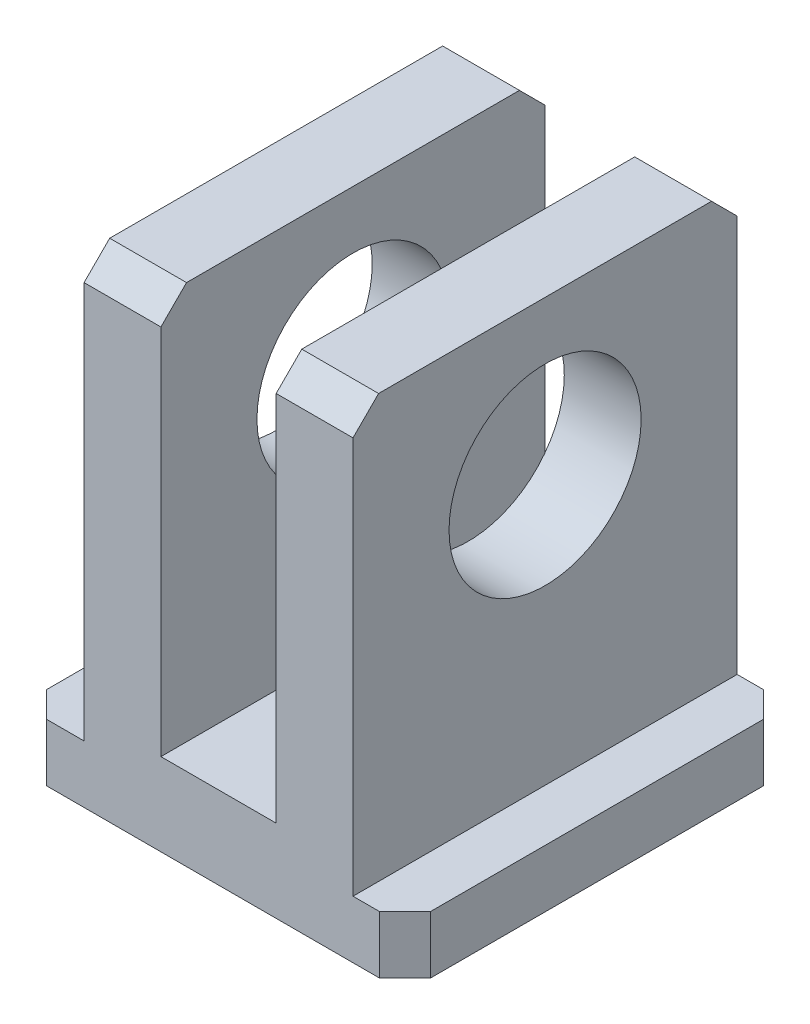
ISO-10303-21;
HEADER;
FILE_DESCRIPTION(('STEP AP214'),'2;1');
FILE_NAME('part.step','',(''),(''),'','','');
FILE_SCHEMA(('AUTOMOTIVE_DESIGN { 1 0 10303 214 1 1 1 1 }'));
ENDSEC;
DATA;
#1=APPLICATION_CONTEXT('core data for automotive mechanical design processes');
#2=APPLICATION_PROTOCOL_DEFINITION('international standard','automotive_design',2000,#1);
#3=PRODUCT_CONTEXT('',#1,'mechanical');
#4=PRODUCT('Part','Part','',(#3));
#5=PRODUCT_RELATED_PRODUCT_CATEGORY('part','',(#4));
#6=PRODUCT_DEFINITION_FORMATION('','',#4);
#7=PRODUCT_DEFINITION_CONTEXT('part definition',#1,'design');
#8=PRODUCT_DEFINITION('design','',#6,#7);
#9=PRODUCT_DEFINITION_SHAPE('','',#8);
#10=(LENGTH_UNIT() NAMED_UNIT(*) SI_UNIT(.MILLI.,.METRE.));
#11=(NAMED_UNIT(*) PLANE_ANGLE_UNIT() SI_UNIT($,.RADIAN.));
#12=(NAMED_UNIT(*) SI_UNIT($,.STERADIAN.) SOLID_ANGLE_UNIT());
#13=UNCERTAINTY_MEASURE_WITH_UNIT(LENGTH_MEASURE(1.E-05),#10,'distance_accuracy_value','');
#14=(GEOMETRIC_REPRESENTATION_CONTEXT(3) GLOBAL_UNCERTAINTY_ASSIGNED_CONTEXT((#13)) GLOBAL_UNIT_ASSIGNED_CONTEXT((#10,
#11,#12)) REPRESENTATION_CONTEXT('',''));
#15=CARTESIAN_POINT('',(0.,0.,0.));
#16=DIRECTION('',(0.,0.,1.));
#17=DIRECTION('',(1.,0.,0.));
#18=AXIS2_PLACEMENT_3D('',#15,#16,#17);
#19=CARTESIAN_POINT('',(15.,37.5,0.));
#20=DIRECTION('',(0.,0.,-1.));
#21=DIRECTION('',(-1.,0.,0.));
#22=AXIS2_PLACEMENT_3D('',#19,#20,#21);
#23=PLANE('',#22);
#24=DIRECTION('',(1.,0.,0.));
#25=VECTOR('',#24,1.);
#26=CARTESIAN_POINT('',(0.,4.50000000000001,0.));
#27=LINE('',#26,#25);
#28=CARTESIAN_POINT('',(-13.,4.49999999999999,0.));
#29=VERTEX_POINT('',#28);
#30=CARTESIAN_POINT('',(-10.0611181190047,4.5,0.));
#31=VERTEX_POINT('',#30);
#32=EDGE_CURVE('E200',#29,#31,#27,.T.);
#33=ORIENTED_EDGE('',*,*,#32,.F.);
#34=DIRECTION('',(0.,-1.,0.));
#35=VECTOR('',#34,1.);
#36=CARTESIAN_POINT('',(-13.,37.5,0.));
#37=LINE('',#36,#35);
#38=CARTESIAN_POINT('',(-13.,0.,0.));
#39=VERTEX_POINT('',#38);
#40=EDGE_CURVE('E286',#29,#39,#37,.T.);
#41=ORIENTED_EDGE('',*,*,#40,.T.);
#42=DIRECTION('',(-1.,0.,0.));
#43=VECTOR('',#42,1.);
#44=CARTESIAN_POINT('',(15.,0.,0.));
#45=LINE('',#44,#43);
#46=CARTESIAN_POINT('',(13.,0.,0.));
#47=VERTEX_POINT('',#46);
#48=EDGE_CURVE('E270',#47,#39,#45,.T.);
#49=ORIENTED_EDGE('',*,*,#48,.F.);
#50=DIRECTION('',(0.,1.,0.));
#51=VECTOR('',#50,1.);
#52=CARTESIAN_POINT('',(13.,4.49999999999999,0.));
#53=LINE('',#52,#51);
#54=CARTESIAN_POINT('',(13.,4.49999999999999,0.));
#55=VERTEX_POINT('',#54);
#56=EDGE_CURVE('E284',#47,#55,#53,.T.);
#57=ORIENTED_EDGE('',*,*,#56,.T.);
#58=DIRECTION('',(-1.,0.,0.));
#59=VECTOR('',#58,1.);
#60=CARTESIAN_POINT('',(0.,4.49999999999999,0.));
#61=LINE('',#60,#59);
#62=CARTESIAN_POINT('',(10.9388818809953,4.49999999999999,0.));
#63=VERTEX_POINT('',#62);
#64=EDGE_CURVE('E223',#55,#63,#61,.T.);
#65=ORIENTED_EDGE('',*,*,#64,.T.);
#66=DIRECTION('',(0.,1.,0.));
#67=VECTOR('',#66,1.);
#68=CARTESIAN_POINT('',(10.9388818809953,0.,0.));
#69=LINE('',#68,#67);
#70=CARTESIAN_POINT('',(10.9388818809953,35.5,0.));
#71=VERTEX_POINT('',#70);
#72=EDGE_CURVE('E226',#63,#71,#69,.T.);
#73=ORIENTED_EDGE('',*,*,#72,.T.);
#74=DIRECTION('',(-1.,0.,0.));
#75=VECTOR('',#74,1.);
#76=CARTESIAN_POINT('',(15.,35.5,0.));
#77=LINE('',#76,#75);
#78=CARTESIAN_POINT('',(4.93888188099532,35.5,0.));
#79=VERTEX_POINT('',#78);
#80=EDGE_CURVE('E281',#71,#79,#77,.T.);
#81=ORIENTED_EDGE('',*,*,#80,.T.);
#82=DIRECTION('',(0.,-1.,0.));
#83=VECTOR('',#82,1.);
#84=CARTESIAN_POINT('',(4.93888188099533,0.,0.));
#85=LINE('',#84,#83);
#86=CARTESIAN_POINT('',(4.93888188099533,6.44122754228266,0.));
#87=VERTEX_POINT('',#86);
#88=EDGE_CURVE('E249',#79,#87,#85,.T.);
#89=ORIENTED_EDGE('',*,*,#88,.T.);
#90=DIRECTION('',(1.,0.,0.));
#91=VECTOR('',#90,1.);
#92=CARTESIAN_POINT('',(0.,6.44122754228266,0.));
#93=LINE('',#92,#91);
#94=CARTESIAN_POINT('',(-4.06111811900468,6.44122754228266,0.));
#95=VERTEX_POINT('',#94);
#96=EDGE_CURVE('E217',#95,#87,#93,.T.);
#97=ORIENTED_EDGE('',*,*,#96,.F.);
#98=DIRECTION('',(0.,-1.,0.));
#99=VECTOR('',#98,1.);
#100=CARTESIAN_POINT('',(-4.06111811900468,0.,0.));
#101=LINE('',#100,#99);
#102=CARTESIAN_POINT('',(-4.06111811900467,35.5,0.));
#103=VERTEX_POINT('',#102);
#104=EDGE_CURVE('E242',#103,#95,#101,.T.);
#105=ORIENTED_EDGE('',*,*,#104,.F.);
#106=DIRECTION('',(-1.,0.,0.));
#107=VECTOR('',#106,1.);
#108=CARTESIAN_POINT('',(15.,35.5,0.));
#109=LINE('',#108,#107);
#110=CARTESIAN_POINT('',(-10.0611181190047,35.5,0.));
#111=VERTEX_POINT('',#110);
#112=EDGE_CURVE('E273',#103,#111,#109,.T.);
#113=ORIENTED_EDGE('',*,*,#112,.T.);
#114=DIRECTION('',(0.,1.,0.));
#115=VECTOR('',#114,1.);
#116=CARTESIAN_POINT('',(-10.0611181190047,0.,0.));
#117=LINE('',#116,#115);
#118=EDGE_CURVE('E193',#31,#111,#117,.T.);
#119=ORIENTED_EDGE('',*,*,#118,.F.);
#120=EDGE_LOOP('',(#33,#41,#49,#57,#65,#73,#81,#89,#97,#105,#113,#119));
#121=FACE_BOUND('',#120,.T.);
#122=ADVANCED_FACE('F43',(#121),#23,.F.);
#123=CARTESIAN_POINT('',(15.,0.,-30.));
#124=DIRECTION('',(0.,0.,1.));
#125=DIRECTION('',(1.,0.,0.));
#126=AXIS2_PLACEMENT_3D('',#123,#124,#125);
#127=PLANE('',#126);
#128=DIRECTION('',(-1.,0.,0.));
#129=VECTOR('',#128,1.);
#130=CARTESIAN_POINT('',(0.,4.49999999999999,-30.));
#131=LINE('',#130,#129);
#132=CARTESIAN_POINT('',(13.,4.49999999999999,-30.));
#133=VERTEX_POINT('',#132);
#134=CARTESIAN_POINT('',(10.9388818809953,4.49999999999999,-30.));
#135=VERTEX_POINT('',#134);
#136=EDGE_CURVE('E222',#133,#135,#131,.T.);
#137=ORIENTED_EDGE('',*,*,#136,.F.);
#138=DIRECTION('',(0.,-1.,0.));
#139=VECTOR('',#138,1.);
#140=CARTESIAN_POINT('',(13.,0.,-30.));
#141=LINE('',#140,#139);
#142=CARTESIAN_POINT('',(13.,0.,-30.));
#143=VERTEX_POINT('',#142);
#144=EDGE_CURVE('E320',#133,#143,#141,.T.);
#145=ORIENTED_EDGE('',*,*,#144,.T.);
#146=DIRECTION('',(-1.,0.,0.));
#147=VECTOR('',#146,1.);
#148=CARTESIAN_POINT('',(15.,0.,-30.));
#149=LINE('',#148,#147);
#150=CARTESIAN_POINT('',(-13.,0.,-30.));
#151=VERTEX_POINT('',#150);
#152=EDGE_CURVE('E266',#143,#151,#149,.T.);
#153=ORIENTED_EDGE('',*,*,#152,.T.);
#154=DIRECTION('',(0.,1.,0.));
#155=VECTOR('',#154,1.);
#156=CARTESIAN_POINT('',(-13.,0.,-30.));
#157=LINE('',#156,#155);
#158=CARTESIAN_POINT('',(-13.,4.49999999999999,-30.));
#159=VERTEX_POINT('',#158);
#160=EDGE_CURVE('E191',#151,#159,#157,.T.);
#161=ORIENTED_EDGE('',*,*,#160,.T.);
#162=DIRECTION('',(1.,0.,0.));
#163=VECTOR('',#162,1.);
#164=CARTESIAN_POINT('',(0.,4.50000000000001,-30.));
#165=LINE('',#164,#163);
#166=CARTESIAN_POINT('',(-10.0611181190047,4.5,-30.));
#167=VERTEX_POINT('',#166);
#168=EDGE_CURVE('E182',#159,#167,#165,.T.);
#169=ORIENTED_EDGE('',*,*,#168,.T.);
#170=DIRECTION('',(0.,1.,0.));
#171=VECTOR('',#170,1.);
#172=CARTESIAN_POINT('',(-10.0611181190047,0.,-30.));
#173=LINE('',#172,#171);
#174=CARTESIAN_POINT('',(-10.0611181190047,35.5,-30.));
#175=VERTEX_POINT('',#174);
#176=EDGE_CURVE('E187',#167,#175,#173,.T.);
#177=ORIENTED_EDGE('',*,*,#176,.T.);
#178=DIRECTION('',(1.,0.,0.));
#179=VECTOR('',#178,1.);
#180=CARTESIAN_POINT('',(15.,35.5,-30.));
#181=LINE('',#180,#179);
#182=CARTESIAN_POINT('',(-4.06111811900467,35.5,-30.));
#183=VERTEX_POINT('',#182);
#184=EDGE_CURVE('E317',#175,#183,#181,.T.);
#185=ORIENTED_EDGE('',*,*,#184,.T.);
#186=DIRECTION('',(0.,-1.,0.));
#187=VECTOR('',#186,1.);
#188=CARTESIAN_POINT('',(-4.06111811900468,0.,-30.));
#189=LINE('',#188,#187);
#190=CARTESIAN_POINT('',(-4.06111811900468,6.44122754228266,-30.));
#191=VERTEX_POINT('',#190);
#192=EDGE_CURVE('E244',#183,#191,#189,.T.);
#193=ORIENTED_EDGE('',*,*,#192,.T.);
#194=DIRECTION('',(1.,0.,0.));
#195=VECTOR('',#194,1.);
#196=CARTESIAN_POINT('',(0.,6.44122754228266,-30.));
#197=LINE('',#196,#195);
#198=CARTESIAN_POINT('',(4.93888188099533,6.44122754228266,-30.));
#199=VERTEX_POINT('',#198);
#200=EDGE_CURVE('E238',#191,#199,#197,.T.);
#201=ORIENTED_EDGE('',*,*,#200,.T.);
#202=DIRECTION('',(0.,-1.,0.));
#203=VECTOR('',#202,1.);
#204=CARTESIAN_POINT('',(4.93888188099533,0.,-30.));
#205=LINE('',#204,#203);
#206=CARTESIAN_POINT('',(4.93888188099532,35.5,-30.));
#207=VERTEX_POINT('',#206);
#208=EDGE_CURVE('E241',#207,#199,#205,.T.);
#209=ORIENTED_EDGE('',*,*,#208,.F.);
#210=DIRECTION('',(1.,0.,0.));
#211=VECTOR('',#210,1.);
#212=CARTESIAN_POINT('',(15.,35.5,-30.));
#213=LINE('',#212,#211);
#214=CARTESIAN_POINT('',(10.9388818809953,35.5,-30.));
#215=VERTEX_POINT('',#214);
#216=EDGE_CURVE('E315',#207,#215,#213,.T.);
#217=ORIENTED_EDGE('',*,*,#216,.T.);
#218=DIRECTION('',(0.,1.,0.));
#219=VECTOR('',#218,1.);
#220=CARTESIAN_POINT('',(10.9388818809953,0.,-30.));
#221=LINE('',#220,#219);
#222=EDGE_CURVE('E219',#135,#215,#221,.T.);
#223=ORIENTED_EDGE('',*,*,#222,.F.);
#224=EDGE_LOOP('',(#137,#145,#153,#161,#169,#177,#185,#193,#201,#209,#217,#223));
#225=FACE_BOUND('',#224,.T.);
#226=ADVANCED_FACE('F185',(#225),#127,.F.);
#227=CARTESIAN_POINT('',(15.,37.5,-30.));
#228=DIRECTION('',(0.,-1.,0.));
#229=DIRECTION('',(0.,0.,-1.));
#230=AXIS2_PLACEMENT_3D('',#227,#228,#229);
#231=PLANE('',#230);
#232=DIRECTION('',(0.,0.,1.));
#233=VECTOR('',#232,1.);
#234=CARTESIAN_POINT('',(4.93888188099533,37.5,-30.));
#235=LINE('',#234,#233);
#236=CARTESIAN_POINT('',(4.93888188099533,37.5,-28.));
#237=VERTEX_POINT('',#236);
#238=CARTESIAN_POINT('',(4.93888188099533,37.5,-2.00000000000002));
#239=VERTEX_POINT('',#238);
#240=EDGE_CURVE('E258',#237,#239,#235,.T.);
#241=ORIENTED_EDGE('',*,*,#240,.T.);
#242=DIRECTION('',(1.,0.,0.));
#243=VECTOR('',#242,1.);
#244=CARTESIAN_POINT('',(15.,37.5,-2.00000000000001));
#245=LINE('',#244,#243);
#246=CARTESIAN_POINT('',(10.9388818809953,37.5,-2.00000000000002));
#247=VERTEX_POINT('',#246);
#248=EDGE_CURVE('E329',#239,#247,#245,.T.);
#249=ORIENTED_EDGE('',*,*,#248,.T.);
#250=DIRECTION('',(0.,0.,1.));
#251=VECTOR('',#250,1.);
#252=CARTESIAN_POINT('',(10.9388818809953,37.5,-30.));
#253=LINE('',#252,#251);
#254=CARTESIAN_POINT('',(10.9388818809953,37.5,-28.));
#255=VERTEX_POINT('',#254);
#256=EDGE_CURVE('E213',#255,#247,#253,.T.);
#257=ORIENTED_EDGE('',*,*,#256,.F.);
#258=DIRECTION('',(-1.,0.,0.));
#259=VECTOR('',#258,1.);
#260=CARTESIAN_POINT('',(15.,37.5,-28.));
#261=LINE('',#260,#259);
#262=EDGE_CURVE('E326',#255,#237,#261,.T.);
#263=ORIENTED_EDGE('',*,*,#262,.T.);
#264=EDGE_LOOP('',(#241,#249,#257,#263));
#265=FACE_BOUND('',#264,.T.);
#266=ADVANCED_FACE('F375',(#265),#231,.F.);
#267=CARTESIAN_POINT('',(15.,0.,0.));
#268=DIRECTION('',(1.,0.,0.));
#269=DIRECTION('',(0.,0.,-1.));
#270=AXIS2_PLACEMENT_3D('',#267,#268,#269);
#271=PLANE('',#270);
#272=DIRECTION('',(0.,0.,1.));
#273=VECTOR('',#272,1.);
#274=CARTESIAN_POINT('',(15.,4.49999999999999,-30.));
#275=LINE('',#274,#273);
#276=CARTESIAN_POINT('',(15.,4.49999999999999,-28.));
#277=VERTEX_POINT('',#276);
#278=CARTESIAN_POINT('',(15.,4.49999999999999,-2.00000000000001));
#279=VERTEX_POINT('',#278);
#280=EDGE_CURVE('E233',#277,#279,#275,.T.);
#281=ORIENTED_EDGE('',*,*,#280,.T.);
#282=DIRECTION('',(0.,-1.,0.));
#283=VECTOR('',#282,1.);
#284=CARTESIAN_POINT('',(15.,0.,-2.));
#285=LINE('',#284,#283);
#286=CARTESIAN_POINT('',(15.,0.,-2.));
#287=VERTEX_POINT('',#286);
#288=EDGE_CURVE('E308',#279,#287,#285,.T.);
#289=ORIENTED_EDGE('',*,*,#288,.T.);
#290=DIRECTION('',(0.,0.,-1.));
#291=VECTOR('',#290,1.);
#292=CARTESIAN_POINT('',(15.,0.,0.));
#293=LINE('',#292,#291);
#294=CARTESIAN_POINT('',(15.,0.,-28.));
#295=VERTEX_POINT('',#294);
#296=EDGE_CURVE('E263',#287,#295,#293,.T.);
#297=ORIENTED_EDGE('',*,*,#296,.T.);
#298=DIRECTION('',(0.,1.,0.));
#299=VECTOR('',#298,1.);
#300=CARTESIAN_POINT('',(15.,4.49999999999999,-28.));
#301=LINE('',#300,#299);
#302=EDGE_CURVE('E305',#295,#277,#301,.T.);
#303=ORIENTED_EDGE('',*,*,#302,.T.);
#304=EDGE_LOOP('',(#281,#289,#297,#303));
#305=FACE_BOUND('',#304,.T.);
#306=ADVANCED_FACE('F463',(#305),#271,.T.);
#307=CARTESIAN_POINT('',(15.,0.,0.));
#308=DIRECTION('',(0.,1.,0.));
#309=DIRECTION('',(0.,0.,1.));
#310=AXIS2_PLACEMENT_3D('',#307,#308,#309);
#311=PLANE('',#310);
#312=ORIENTED_EDGE('',*,*,#48,.T.);
#313=DIRECTION('',(0.707106781186546,0.,0.707106781186549));
#314=VECTOR('',#313,1.);
#315=CARTESIAN_POINT('',(-13.,0.,0.));
#316=LINE('',#315,#314);
#317=CARTESIAN_POINT('',(-15.,0.,-2.00000000000001));
#318=VERTEX_POINT('',#317);
#319=EDGE_CURVE('E295',#39,#318,#316,.F.);
#320=ORIENTED_EDGE('',*,*,#319,.T.);
#321=DIRECTION('',(0.,0.,-1.));
#322=VECTOR('',#321,1.);
#323=CARTESIAN_POINT('',(-15.,0.,0.));
#324=LINE('',#323,#322);
#325=CARTESIAN_POINT('',(-15.,0.,-28.));
#326=VERTEX_POINT('',#325);
#327=EDGE_CURVE('E255',#318,#326,#324,.T.);
#328=ORIENTED_EDGE('',*,*,#327,.T.);
#329=DIRECTION('',(-0.707106781186546,0.,0.707106781186549));
#330=VECTOR('',#329,1.);
#331=CARTESIAN_POINT('',(-13.,0.,-30.));
#332=LINE('',#331,#330);
#333=EDGE_CURVE('E289',#326,#151,#332,.F.);
#334=ORIENTED_EDGE('',*,*,#333,.T.);
#335=ORIENTED_EDGE('',*,*,#152,.F.);
#336=DIRECTION('',(0.707106781186549,0.,0.707106781186546));
#337=VECTOR('',#336,1.);
#338=CARTESIAN_POINT('',(15.,0.,-28.));
#339=LINE('',#338,#337);
#340=EDGE_CURVE('E291',#143,#295,#339,.T.);
#341=ORIENTED_EDGE('',*,*,#340,.T.);
#342=ORIENTED_EDGE('',*,*,#296,.F.);
#343=DIRECTION('',(-0.707106781186549,0.,0.707106781186546));
#344=VECTOR('',#343,1.);
#345=CARTESIAN_POINT('',(15.,0.,-2.));
#346=LINE('',#345,#344);
#347=EDGE_CURVE('E293',#287,#47,#346,.T.);
#348=ORIENTED_EDGE('',*,*,#347,.T.);
#349=EDGE_LOOP('',(#312,#320,#328,#334,#335,#341,#342,#348));
#350=FACE_BOUND('',#349,.T.);
#351=ADVANCED_FACE('F379',(#350),#311,.F.);
#352=DIRECTION('',(0.,0.,1.));
#353=VECTOR('',#352,1.);
#354=CARTESIAN_POINT('',(-10.0611181190047,37.5,-30.));
#355=LINE('',#354,#353);
#356=CARTESIAN_POINT('',(-10.0611181190047,37.5,-28.));
#357=VERTEX_POINT('',#356);
#358=CARTESIAN_POINT('',(-10.0611181190047,37.5,-2.00000000000002));
#359=VERTEX_POINT('',#358);
#360=EDGE_CURVE('E204',#357,#359,#355,.T.);
#361=ORIENTED_EDGE('',*,*,#360,.T.);
#362=DIRECTION('',(1.,0.,0.));
#363=VECTOR('',#362,1.);
#364=CARTESIAN_POINT('',(15.,37.5,-2.00000000000001));
#365=LINE('',#364,#363);
#366=CARTESIAN_POINT('',(-4.06111811900467,37.5,-2.00000000000002));
#367=VERTEX_POINT('',#366);
#368=EDGE_CURVE('E59',#359,#367,#365,.T.);
#369=ORIENTED_EDGE('',*,*,#368,.T.);
#370=DIRECTION('',(0.,0.,1.));
#371=VECTOR('',#370,1.);
#372=CARTESIAN_POINT('',(-4.06111811900467,37.5,-30.));
#373=LINE('',#372,#371);
#374=CARTESIAN_POINT('',(-4.06111811900467,37.5,-28.));
#375=VERTEX_POINT('',#374);
#376=EDGE_CURVE('E256',#375,#367,#373,.T.);
#377=ORIENTED_EDGE('',*,*,#376,.F.);
#378=DIRECTION('',(-1.,0.,0.));
#379=VECTOR('',#378,1.);
#380=CARTESIAN_POINT('',(15.,37.5,-28.));
#381=LINE('',#380,#379);
#382=EDGE_CURVE('E338',#375,#357,#381,.T.);
#383=ORIENTED_EDGE('',*,*,#382,.T.);
#384=EDGE_LOOP('',(#361,#369,#377,#383));
#385=FACE_BOUND('',#384,.T.);
#386=ADVANCED_FACE('F342',(#385),#231,.F.);
#387=CARTESIAN_POINT('',(-15.,0.,0.));
#388=DIRECTION('',(1.,0.,0.));
#389=DIRECTION('',(0.,0.,-1.));
#390=AXIS2_PLACEMENT_3D('',#387,#388,#389);
#391=PLANE('',#390);
#392=ORIENTED_EDGE('',*,*,#327,.F.);
#393=DIRECTION('',(0.,1.,0.));
#394=VECTOR('',#393,1.);
#395=CARTESIAN_POINT('',(-15.,0.,-2.00000000000001));
#396=LINE('',#395,#394);
#397=CARTESIAN_POINT('',(-15.,4.49999999999999,-2.00000000000002));
#398=VERTEX_POINT('',#397);
#399=EDGE_CURVE('E299',#318,#398,#396,.T.);
#400=ORIENTED_EDGE('',*,*,#399,.T.);
#401=DIRECTION('',(0.,0.,1.));
#402=VECTOR('',#401,1.);
#403=CARTESIAN_POINT('',(-15.,4.49999999999999,-30.));
#404=LINE('',#403,#402);
#405=CARTESIAN_POINT('',(-15.,4.49999999999999,-28.));
#406=VERTEX_POINT('',#405);
#407=EDGE_CURVE('E215',#406,#398,#404,.T.);
#408=ORIENTED_EDGE('',*,*,#407,.F.);
#409=DIRECTION('',(0.,-1.,0.));
#410=VECTOR('',#409,1.);
#411=CARTESIAN_POINT('',(-15.,0.,-28.));
#412=LINE('',#411,#410);
#413=EDGE_CURVE('E297',#406,#326,#412,.T.);
#414=ORIENTED_EDGE('',*,*,#413,.T.);
#415=EDGE_LOOP('',(#392,#400,#408,#414));
#416=FACE_BOUND('',#415,.T.);
#417=ADVANCED_FACE('F467',(#416),#391,.F.);
#418=CARTESIAN_POINT('',(0.,4.50000000000001,-30.));
#419=DIRECTION('',(0.,-1.,0.));
#420=DIRECTION('',(1.,0.,0.));
#421=AXIS2_PLACEMENT_3D('',#418,#419,#420);
#422=PLANE('',#421);
#423=ORIENTED_EDGE('',*,*,#407,.T.);
#424=DIRECTION('',(-0.707106781186546,0.,-0.707106781186549));
#425=VECTOR('',#424,1.);
#426=CARTESIAN_POINT('',(-13.,4.49999999999999,0.));
#427=LINE('',#426,#425);
#428=EDGE_CURVE('E303',#398,#29,#427,.F.);
#429=ORIENTED_EDGE('',*,*,#428,.T.);
#430=ORIENTED_EDGE('',*,*,#32,.T.);
#431=DIRECTION('',(0.,0.,1.));
#432=VECTOR('',#431,1.);
#433=CARTESIAN_POINT('',(-10.0611181190047,4.5,-30.));
#434=LINE('',#433,#432);
#435=EDGE_CURVE('E196',#167,#31,#434,.T.);
#436=ORIENTED_EDGE('',*,*,#435,.F.);
#437=ORIENTED_EDGE('',*,*,#168,.F.);
#438=DIRECTION('',(0.707106781186546,0.,-0.707106781186549));
#439=VECTOR('',#438,1.);
#440=CARTESIAN_POINT('',(-13.,4.49999999999999,-30.));
#441=LINE('',#440,#439);
#442=EDGE_CURVE('E301',#159,#406,#441,.F.);
#443=ORIENTED_EDGE('',*,*,#442,.T.);
#444=EDGE_LOOP('',(#423,#429,#430,#436,#437,#443));
#445=FACE_BOUND('',#444,.T.);
#446=ADVANCED_FACE('F198',(#445),#422,.F.);
#447=CARTESIAN_POINT('',(-10.0611181190047,0.,-30.));
#448=DIRECTION('',(1.,0.,0.));
#449=DIRECTION('',(0.,0.,-1.));
#450=AXIS2_PLACEMENT_3D('',#447,#448,#449);
#451=PLANE('',#450);
#452=CARTESIAN_POINT('',(-10.0611181190047,25.5,-15.));
#453=DIRECTION('',(-1.,0.,0.));
#454=DIRECTION('',(0.,0.,1.));
#455=AXIS2_PLACEMENT_3D('',#452,#453,#454);
#456=CIRCLE('',#455,7.5);
#457=CARTESIAN_POINT('',(-10.0611181190047,25.5,-7.5));
#458=VERTEX_POINT('',#457);
#459=EDGE_CURVE('E278',#458,#458,#456,.T.);
#460=ORIENTED_EDGE('',*,*,#459,.F.);
#461=EDGE_LOOP('',(#460));
#462=FACE_BOUND('',#461,.T.);
#463=ORIENTED_EDGE('',*,*,#118,.T.);
#464=DIRECTION('',(0.,-0.707106781186546,0.707106781186549));
#465=VECTOR('',#464,1.);
#466=CARTESIAN_POINT('',(-10.0611181190047,35.5,0.));
#467=LINE('',#466,#465);
#468=EDGE_CURVE('E336',#111,#359,#467,.F.);
#469=ORIENTED_EDGE('',*,*,#468,.T.);
#470=ORIENTED_EDGE('',*,*,#360,.F.);
#471=DIRECTION('',(0.,0.707106781186549,0.707106781186546));
#472=VECTOR('',#471,1.);
#473=CARTESIAN_POINT('',(-10.0611181190047,37.5,-28.));
#474=LINE('',#473,#472);
#475=EDGE_CURVE('E208',#357,#175,#474,.F.);
#476=ORIENTED_EDGE('',*,*,#475,.T.);
#477=ORIENTED_EDGE('',*,*,#176,.F.);
#478=ORIENTED_EDGE('',*,*,#435,.T.);
#479=EDGE_LOOP('',(#463,#469,#470,#476,#477,#478));
#480=FACE_BOUND('',#479,.T.);
#481=ADVANCED_FACE('F206',(#462,#480),#451,.F.);
#482=CARTESIAN_POINT('',(10.9388818809953,0.,-30.));
#483=DIRECTION('',(1.,0.,0.));
#484=DIRECTION('',(0.,0.,-1.));
#485=AXIS2_PLACEMENT_3D('',#482,#483,#484);
#486=PLANE('',#485);
#487=CARTESIAN_POINT('',(10.9388818809953,25.5,-15.));
#488=DIRECTION('',(1.,0.,0.));
#489=DIRECTION('',(0.,0.,-1.));
#490=AXIS2_PLACEMENT_3D('',#487,#488,#489);
#491=CIRCLE('',#490,7.5);
#492=CARTESIAN_POINT('',(10.9388818809953,25.5,-7.5));
#493=VERTEX_POINT('',#492);
#494=EDGE_CURVE('E229',#493,#493,#491,.T.);
#495=ORIENTED_EDGE('',*,*,#494,.F.);
#496=EDGE_LOOP('',(#495));
#497=FACE_BOUND('',#496,.T.);
#498=ORIENTED_EDGE('',*,*,#256,.T.);
#499=DIRECTION('',(0.,0.707106781186546,-0.707106781186549));
#500=VECTOR('',#499,1.);
#501=CARTESIAN_POINT('',(10.9388818809953,32.7500000000001,2.74999999999994));
#502=LINE('',#501,#500);
#503=EDGE_CURVE('E333',#247,#71,#502,.F.);
#504=ORIENTED_EDGE('',*,*,#503,.T.);
#505=ORIENTED_EDGE('',*,*,#72,.F.);
#506=DIRECTION('',(0.,0.,1.));
#507=VECTOR('',#506,1.);
#508=CARTESIAN_POINT('',(10.9388818809953,4.49999999999999,-30.));
#509=LINE('',#508,#507);
#510=EDGE_CURVE('E225',#135,#63,#509,.T.);
#511=ORIENTED_EDGE('',*,*,#510,.F.);
#512=ORIENTED_EDGE('',*,*,#222,.T.);
#513=DIRECTION('',(0.,-0.707106781186549,-0.707106781186546));
#514=VECTOR('',#513,1.);
#515=CARTESIAN_POINT('',(10.9388818809953,17.7499999999999,-47.75));
#516=LINE('',#515,#514);
#517=EDGE_CURVE('E331',#215,#255,#516,.F.);
#518=ORIENTED_EDGE('',*,*,#517,.T.);
#519=EDGE_LOOP('',(#498,#504,#505,#511,#512,#518));
#520=FACE_BOUND('',#519,.T.);
#521=ADVANCED_FACE('F428',(#497,#520),#486,.T.);
#522=CARTESIAN_POINT('',(0.,4.49999999999999,-30.));
#523=DIRECTION('',(0.,1.,0.));
#524=DIRECTION('',(0.,0.,1.));
#525=AXIS2_PLACEMENT_3D('',#522,#523,#524);
#526=PLANE('',#525);
#527=ORIENTED_EDGE('',*,*,#64,.F.);
#528=DIRECTION('',(0.707106781186549,0.,-0.707106781186546));
#529=VECTOR('',#528,1.);
#530=CARTESIAN_POINT('',(21.5,4.49999999999999,-8.49999999999995));
#531=LINE('',#530,#529);
#532=EDGE_CURVE('E313',#55,#279,#531,.T.);
#533=ORIENTED_EDGE('',*,*,#532,.T.);
#534=ORIENTED_EDGE('',*,*,#280,.F.);
#535=DIRECTION('',(-0.707106781186549,0.,-0.707106781186546));
#536=VECTOR('',#535,1.);
#537=CARTESIAN_POINT('',(6.49999999999997,4.49999999999999,-36.5));
#538=LINE('',#537,#536);
#539=EDGE_CURVE('E311',#277,#133,#538,.T.);
#540=ORIENTED_EDGE('',*,*,#539,.T.);
#541=ORIENTED_EDGE('',*,*,#136,.T.);
#542=ORIENTED_EDGE('',*,*,#510,.T.);
#543=EDGE_LOOP('',(#527,#533,#534,#540,#541,#542));
#544=FACE_BOUND('',#543,.T.);
#545=ADVANCED_FACE('F437',(#544),#526,.T.);
#546=CARTESIAN_POINT('',(0.,6.44122754228266,-30.));
#547=DIRECTION('',(0.,-1.,0.));
#548=DIRECTION('',(0.,0.,-1.));
#549=AXIS2_PLACEMENT_3D('',#546,#547,#548);
#550=PLANE('',#549);
#551=ORIENTED_EDGE('',*,*,#96,.T.);
#552=DIRECTION('',(0.,0.,1.));
#553=VECTOR('',#552,1.);
#554=CARTESIAN_POINT('',(4.93888188099533,6.44122754228266,-30.));
#555=LINE('',#554,#553);
#556=EDGE_CURVE('E246',#199,#87,#555,.T.);
#557=ORIENTED_EDGE('',*,*,#556,.F.);
#558=ORIENTED_EDGE('',*,*,#200,.F.);
#559=DIRECTION('',(0.,0.,1.));
#560=VECTOR('',#559,1.);
#561=CARTESIAN_POINT('',(-4.06111811900468,6.44122754228266,-30.));
#562=LINE('',#561,#560);
#563=EDGE_CURVE('E252',#191,#95,#562,.T.);
#564=ORIENTED_EDGE('',*,*,#563,.T.);
#565=EDGE_LOOP('',(#551,#557,#558,#564));
#566=FACE_BOUND('',#565,.T.);
#567=ADVANCED_FACE('F355',(#566),#550,.F.);
#568=CARTESIAN_POINT('',(-4.06111811900468,0.,-30.));
#569=DIRECTION('',(-1.,0.,0.));
#570=DIRECTION('',(0.,-1.,0.));
#571=AXIS2_PLACEMENT_3D('',#568,#569,#570);
#572=PLANE('',#571);
#573=CARTESIAN_POINT('',(-4.06111811900468,25.5,-15.));
#574=DIRECTION('',(-1.,0.,0.));
#575=DIRECTION('',(0.,-1.,0.));
#576=AXIS2_PLACEMENT_3D('',#573,#574,#575);
#577=CIRCLE('',#576,7.5);
#578=CARTESIAN_POINT('',(-4.06111811900468,18.,-15.));
#579=VERTEX_POINT('',#578);
#580=EDGE_CURVE('E277',#579,#579,#577,.T.);
#581=ORIENTED_EDGE('',*,*,#580,.T.);
#582=EDGE_LOOP('',(#581));
#583=FACE_BOUND('',#582,.T.);
#584=ORIENTED_EDGE('',*,*,#376,.T.);
#585=DIRECTION('',(0.,0.707106781186546,-0.707106781186549));
#586=VECTOR('',#585,1.);
#587=CARTESIAN_POINT('',(-4.06111811900467,35.5,0.));
#588=LINE('',#587,#586);
#589=EDGE_CURVE('E11',#367,#103,#588,.F.);
#590=ORIENTED_EDGE('',*,*,#589,.T.);
#591=ORIENTED_EDGE('',*,*,#104,.T.);
#592=ORIENTED_EDGE('',*,*,#563,.F.);
#593=ORIENTED_EDGE('',*,*,#192,.F.);
#594=DIRECTION('',(0.,-0.707106781186549,-0.707106781186546));
#595=VECTOR('',#594,1.);
#596=CARTESIAN_POINT('',(-4.06111811900467,37.5,-28.));
#597=LINE('',#596,#595);
#598=EDGE_CURVE('E52',#183,#375,#597,.F.);
#599=ORIENTED_EDGE('',*,*,#598,.T.);
#600=EDGE_LOOP('',(#584,#590,#591,#592,#593,#599));
#601=FACE_BOUND('',#600,.T.);
#602=ADVANCED_FACE('F352',(#583,#601),#572,.F.);
#603=CARTESIAN_POINT('',(4.93888188099533,0.,-30.));
#604=DIRECTION('',(-1.,0.,0.));
#605=DIRECTION('',(0.,-1.,0.));
#606=AXIS2_PLACEMENT_3D('',#603,#604,#605);
#607=PLANE('',#606);
#608=CARTESIAN_POINT('',(4.93888188099533,25.5,-15.));
#609=DIRECTION('',(-1.,0.,0.));
#610=DIRECTION('',(0.,-1.,0.));
#611=AXIS2_PLACEMENT_3D('',#608,#609,#610);
#612=CIRCLE('',#611,7.5);
#613=CARTESIAN_POINT('',(4.93888188099533,25.5,-7.5));
#614=VERTEX_POINT('',#613);
#615=EDGE_CURVE('E274',#614,#614,#612,.T.);
#616=ORIENTED_EDGE('',*,*,#615,.F.);
#617=EDGE_LOOP('',(#616));
#618=FACE_BOUND('',#617,.T.);
#619=ORIENTED_EDGE('',*,*,#88,.F.);
#620=DIRECTION('',(0.,-0.707106781186546,0.707106781186549));
#621=VECTOR('',#620,1.);
#622=CARTESIAN_POINT('',(4.93888188099532,32.7500000000001,2.74999999999994));
#623=LINE('',#622,#621);
#624=EDGE_CURVE('E324',#79,#239,#623,.F.);
#625=ORIENTED_EDGE('',*,*,#624,.T.);
#626=ORIENTED_EDGE('',*,*,#240,.F.);
#627=DIRECTION('',(0.,0.707106781186549,0.707106781186546));
#628=VECTOR('',#627,1.);
#629=CARTESIAN_POINT('',(4.93888188099533,17.7499999999999,-47.75));
#630=LINE('',#629,#628);
#631=EDGE_CURVE('E322',#237,#207,#630,.F.);
#632=ORIENTED_EDGE('',*,*,#631,.T.);
#633=ORIENTED_EDGE('',*,*,#208,.T.);
#634=ORIENTED_EDGE('',*,*,#556,.T.);
#635=EDGE_LOOP('',(#619,#625,#626,#632,#633,#634));
#636=FACE_BOUND('',#635,.T.);
#637=ADVANCED_FACE('F445',(#618,#636),#607,.T.);
#638=CARTESIAN_POINT('',(15.,25.5,-15.));
#639=DIRECTION('',(-1.,0.,0.));
#640=DIRECTION('',(0.,0.,1.));
#641=AXIS2_PLACEMENT_3D('',#638,#639,#640);
#642=CYLINDRICAL_SURFACE('',#641,7.5);
#643=CARTESIAN_POINT('',(10.9388818809953,25.5,-7.5));
#644=CARTESIAN_POINT('',(10.8763818809953,25.5,-7.5));
#645=CARTESIAN_POINT('',(10.8138818809953,25.5,-7.5));
#646=CARTESIAN_POINT('',(10.6888818809953,25.5,-7.5));
#647=CARTESIAN_POINT('',(10.6263818809953,25.5,-7.5));
#648=CARTESIAN_POINT('',(10.5013818809953,25.5,-7.5));
#649=CARTESIAN_POINT('',(10.4388818809953,25.5,-7.5));
#650=CARTESIAN_POINT('',(10.3138818809953,25.5,-7.5));
#651=CARTESIAN_POINT('',(10.2513818809953,25.5,-7.5));
#652=CARTESIAN_POINT('',(10.1263818809953,25.5,-7.5));
#653=CARTESIAN_POINT('',(10.0638818809953,25.5,-7.5));
#654=CARTESIAN_POINT('',(9.93888188099532,25.5,-7.5));
#655=CARTESIAN_POINT('',(9.87638188099532,25.5,-7.5));
#656=CARTESIAN_POINT('',(9.75138188099532,25.5,-7.5));
#657=CARTESIAN_POINT('',(9.68888188099532,25.5,-7.5));
#658=CARTESIAN_POINT('',(9.56388188099532,25.5,-7.5));
#659=CARTESIAN_POINT('',(9.50138188099532,25.5,-7.5));
#660=CARTESIAN_POINT('',(9.37638188099532,25.5,-7.5));
#661=CARTESIAN_POINT('',(9.31388188099532,25.5,-7.5));
#662=CARTESIAN_POINT('',(9.18888188099532,25.5,-7.5));
#663=CARTESIAN_POINT('',(9.12638188099532,25.5,-7.5));
#664=CARTESIAN_POINT('',(9.00138188099532,25.5,-7.5));
#665=CARTESIAN_POINT('',(8.93888188099533,25.5,-7.5));
#666=CARTESIAN_POINT('',(8.81388188099533,25.5,-7.5));
#667=CARTESIAN_POINT('',(8.75138188099533,25.5,-7.5));
#668=CARTESIAN_POINT('',(8.62638188099533,25.5,-7.5));
#669=CARTESIAN_POINT('',(8.56388188099533,25.5,-7.5));
#670=CARTESIAN_POINT('',(8.43888188099532,25.5,-7.5));
#671=CARTESIAN_POINT('',(8.37638188099532,25.5,-7.5));
#672=CARTESIAN_POINT('',(8.25138188099532,25.5,-7.5));
#673=CARTESIAN_POINT('',(8.18888188099532,25.5,-7.5));
#674=CARTESIAN_POINT('',(8.06388188099532,25.5,-7.5));
#675=CARTESIAN_POINT('',(8.00138188099533,25.5,-7.5));
#676=CARTESIAN_POINT('',(7.87638188099533,25.5,-7.5));
#677=CARTESIAN_POINT('',(7.81388188099533,25.5,-7.5));
#678=CARTESIAN_POINT('',(7.68888188099533,25.5,-7.5));
#679=CARTESIAN_POINT('',(7.62638188099533,25.5,-7.5));
#680=CARTESIAN_POINT('',(7.50138188099533,25.5,-7.5));
#681=CARTESIAN_POINT('',(7.43888188099533,25.5,-7.5));
#682=CARTESIAN_POINT('',(7.31388188099533,25.5,-7.5));
#683=CARTESIAN_POINT('',(7.25138188099533,25.5,-7.5));
#684=CARTESIAN_POINT('',(7.12638188099533,25.5,-7.5));
#685=CARTESIAN_POINT('',(7.06388188099533,25.5,-7.5));
#686=CARTESIAN_POINT('',(6.93888188099533,25.5,-7.5));
#687=CARTESIAN_POINT('',(6.87638188099533,25.5,-7.5));
#688=CARTESIAN_POINT('',(6.75138188099533,25.5,-7.5));
#689=CARTESIAN_POINT('',(6.68888188099533,25.5,-7.5));
#690=CARTESIAN_POINT('',(6.56388188099533,25.5,-7.5));
#691=CARTESIAN_POINT('',(6.50138188099533,25.5,-7.5));
#692=CARTESIAN_POINT('',(6.37638188099533,25.5,-7.5));
#693=CARTESIAN_POINT('',(6.31388188099533,25.5,-7.5));
#694=CARTESIAN_POINT('',(6.18888188099533,25.5,-7.5));
#695=CARTESIAN_POINT('',(6.12638188099533,25.5,-7.5));
#696=CARTESIAN_POINT('',(6.00138188099533,25.5,-7.5));
#697=CARTESIAN_POINT('',(5.93888188099533,25.5,-7.5));
#698=CARTESIAN_POINT('',(5.81388188099533,25.5,-7.5));
#699=CARTESIAN_POINT('',(5.75138188099533,25.5,-7.5));
#700=CARTESIAN_POINT('',(5.62638188099533,25.5,-7.5));
#701=CARTESIAN_POINT('',(5.56388188099533,25.5,-7.5));
#702=CARTESIAN_POINT('',(5.43888188099533,25.5,-7.5));
#703=CARTESIAN_POINT('',(5.37638188099533,25.5,-7.5));
#704=CARTESIAN_POINT('',(5.25138188099533,25.5,-7.5));
#705=CARTESIAN_POINT('',(5.18888188099533,25.5,-7.5));
#706=CARTESIAN_POINT('',(5.06388188099533,25.5,-7.5));
#707=CARTESIAN_POINT('',(5.00138188099533,25.5,-7.5));
#708=CARTESIAN_POINT('',(4.93888188099533,25.5,-7.5));
#709=B_SPLINE_CURVE_WITH_KNOTS('',3,(#643,#644,#645,#646,#647,#648,#649,#650,#651,#652,#653,
#654,#655,#656,#657,#658,#659,#660,#661,#662,#663,#664,#665,#666,#667,#668,#669,#670,#671,#672,
#673,#674,#675,#676,#677,#678,#679,#680,#681,#682,#683,#684,#685,#686,#687,#688,#689,#690,#691,
#692,#693,#694,#695,#696,#697,#698,#699,#700,#701,#702,#703,#704,#705,#706,#707,#708),
.UNSPECIFIED.,.F.,.F.,(4,2,2,2,2,2,2,2,2,2,2,2,2,2,2,2,2,2,2,2,2,2,2,2,2,2,2,2,2,2,2,2,4),(0.,
0.1875,0.374999999999999,0.562499999999999,0.749999999999999,0.937499999999999,1.125,1.3125,1.5,
1.6875,1.875,2.0625,2.25,2.4375,2.625,2.8125,3.,3.1875,3.375,3.5625,3.75,3.9375,4.125,4.3125,
4.5,4.6875,4.875,5.0625,5.25,5.4375,5.625,5.8125,6.),.UNSPECIFIED.);
#710=EDGE_CURVE('BSEAM447',#493,#614,#709,.T.);
#711=ORIENTED_EDGE('',*,*,#494,.T.);
#712=ORIENTED_EDGE('',*,*,#615,.T.);
#713=ORIENTED_EDGE('',*,*,#710,.T.);
#714=ORIENTED_EDGE('',*,*,#710,.F.);
#715=EDGE_LOOP('',(#711,#713,#712,#714));
#716=FACE_BOUND('',#715,.T.);
#717=ADVANCED_FACE('F447',(#716),#642,.F.);
#718=ORIENTED_EDGE('',*,*,#459,.T.);
#719=EDGE_LOOP('',(#718));
#720=FACE_BOUND('',#719,.T.);
#721=ORIENTED_EDGE('',*,*,#580,.F.);
#722=EDGE_LOOP('',(#721));
#723=FACE_BOUND('',#722,.T.);
#724=ADVANCED_FACE('F388',(#720,#723),#642,.F.);
#725=CARTESIAN_POINT('',(-13.,37.5,0.));
#726=DIRECTION('',(0.707106781186549,0.,-0.707106781186546));
#727=DIRECTION('',(0.,-1.,0.));
#728=AXIS2_PLACEMENT_3D('',#725,#726,#727);
#729=PLANE('',#728);
#730=ORIENTED_EDGE('',*,*,#428,.F.);
#731=ORIENTED_EDGE('',*,*,#399,.F.);
#732=ORIENTED_EDGE('',*,*,#319,.F.);
#733=ORIENTED_EDGE('',*,*,#40,.F.);
#734=EDGE_LOOP('',(#730,#731,#732,#733));
#735=FACE_BOUND('',#734,.T.);
#736=ADVANCED_FACE('F381',(#735),#729,.F.);
#737=CARTESIAN_POINT('',(15.,0.,-2.));
#738=DIRECTION('',(0.707106781186546,0.,0.707106781186549));
#739=DIRECTION('',(0.,1.,0.));
#740=AXIS2_PLACEMENT_3D('',#737,#738,#739);
#741=PLANE('',#740);
#742=ORIENTED_EDGE('',*,*,#532,.F.);
#743=ORIENTED_EDGE('',*,*,#56,.F.);
#744=ORIENTED_EDGE('',*,*,#347,.F.);
#745=ORIENTED_EDGE('',*,*,#288,.F.);
#746=EDGE_LOOP('',(#742,#743,#744,#745));
#747=FACE_BOUND('',#746,.T.);
#748=ADVANCED_FACE('F387',(#747),#741,.T.);
#749=CARTESIAN_POINT('',(15.,0.,-28.));
#750=DIRECTION('',(0.707106781186546,0.,-0.707106781186549));
#751=DIRECTION('',(0.,-1.,0.));
#752=AXIS2_PLACEMENT_3D('',#749,#750,#751);
#753=PLANE('',#752);
#754=ORIENTED_EDGE('',*,*,#340,.F.);
#755=ORIENTED_EDGE('',*,*,#144,.F.);
#756=ORIENTED_EDGE('',*,*,#539,.F.);
#757=ORIENTED_EDGE('',*,*,#302,.F.);
#758=EDGE_LOOP('',(#754,#755,#756,#757));
#759=FACE_BOUND('',#758,.T.);
#760=ADVANCED_FACE('F395',(#759),#753,.T.);
#761=CARTESIAN_POINT('',(-13.,0.,-30.));
#762=DIRECTION('',(0.707106781186549,0.,0.707106781186546));
#763=DIRECTION('',(0.,1.,0.));
#764=AXIS2_PLACEMENT_3D('',#761,#762,#763);
#765=PLANE('',#764);
#766=ORIENTED_EDGE('',*,*,#333,.F.);
#767=ORIENTED_EDGE('',*,*,#413,.F.);
#768=ORIENTED_EDGE('',*,*,#442,.F.);
#769=ORIENTED_EDGE('',*,*,#160,.F.);
#770=EDGE_LOOP('',(#766,#767,#768,#769));
#771=FACE_BOUND('',#770,.T.);
#772=ADVANCED_FACE('F402',(#771),#765,.F.);
#773=CARTESIAN_POINT('',(15.,35.5,0.));
#774=DIRECTION('',(0.,-0.707106781186549,-0.707106781186546));
#775=DIRECTION('',(-1.,0.,0.));
#776=AXIS2_PLACEMENT_3D('',#773,#774,#775);
#777=PLANE('',#776);
#778=ORIENTED_EDGE('',*,*,#503,.F.);
#779=ORIENTED_EDGE('',*,*,#248,.F.);
#780=ORIENTED_EDGE('',*,*,#624,.F.);
#781=ORIENTED_EDGE('',*,*,#80,.F.);
#782=EDGE_LOOP('',(#778,#779,#780,#781));
#783=FACE_BOUND('',#782,.T.);
#784=ADVANCED_FACE('F366',(#783),#777,.F.);
#785=CARTESIAN_POINT('',(15.,35.5,0.));
#786=DIRECTION('',(0.,-0.707106781186549,-0.707106781186546));
#787=DIRECTION('',(-1.,0.,0.));
#788=AXIS2_PLACEMENT_3D('',#785,#786,#787);
#789=PLANE('',#788);
#790=ORIENTED_EDGE('',*,*,#589,.F.);
#791=ORIENTED_EDGE('',*,*,#368,.F.);
#792=ORIENTED_EDGE('',*,*,#468,.F.);
#793=ORIENTED_EDGE('',*,*,#112,.F.);
#794=EDGE_LOOP('',(#790,#791,#792,#793));
#795=FACE_BOUND('',#794,.T.);
#796=ADVANCED_FACE('F347',(#795),#789,.F.);
#797=CARTESIAN_POINT('',(15.,37.5,-28.));
#798=DIRECTION('',(0.,-0.707106781186546,0.707106781186549));
#799=DIRECTION('',(-1.,0.,0.));
#800=AXIS2_PLACEMENT_3D('',#797,#798,#799);
#801=PLANE('',#800);
#802=ORIENTED_EDGE('',*,*,#598,.F.);
#803=ORIENTED_EDGE('',*,*,#184,.F.);
#804=ORIENTED_EDGE('',*,*,#475,.F.);
#805=ORIENTED_EDGE('',*,*,#382,.F.);
#806=EDGE_LOOP('',(#802,#803,#804,#805));
#807=FACE_BOUND('',#806,.T.);
#808=ADVANCED_FACE('F359',(#807),#801,.F.);
#809=CARTESIAN_POINT('',(15.,37.5,-28.));
#810=DIRECTION('',(0.,-0.707106781186546,0.707106781186549));
#811=DIRECTION('',(-1.,0.,0.));
#812=AXIS2_PLACEMENT_3D('',#809,#810,#811);
#813=PLANE('',#812);
#814=ORIENTED_EDGE('',*,*,#517,.F.);
#815=ORIENTED_EDGE('',*,*,#216,.F.);
#816=ORIENTED_EDGE('',*,*,#631,.F.);
#817=ORIENTED_EDGE('',*,*,#262,.F.);
#818=EDGE_LOOP('',(#814,#815,#816,#817));
#819=FACE_BOUND('',#818,.T.);
#820=ADVANCED_FACE('F46',(#819),#813,.F.);
#821=CLOSED_SHELL('',(#122,#226,#266,#306,#351,#386,#417,#446,#481,#521,#545,#567,#602,#637,
#717,#724,#736,#748,#760,#772,#784,#796,#808,#820));
#822=MANIFOLD_SOLID_BREP('B2',#821);
#823=ADVANCED_BREP_SHAPE_REPRESENTATION('',(#18,#822),#14);
#824=SHAPE_DEFINITION_REPRESENTATION(#9,#823);
ENDSEC;
END-ISO-10303-21;
